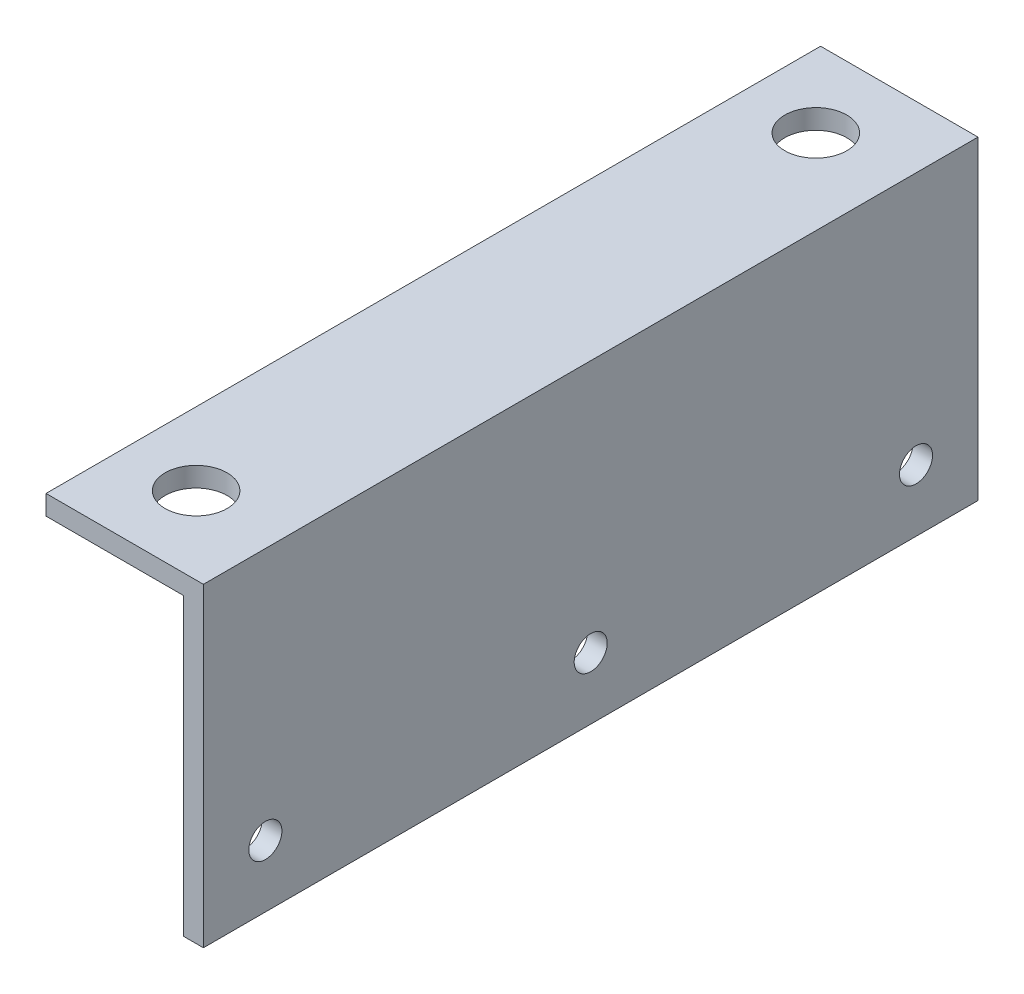
ISO-10303-21;
HEADER;
FILE_DESCRIPTION(('STEP AP214'),'2;1');
FILE_NAME('part.step','',(''),(''),'','','');
FILE_SCHEMA(('AUTOMOTIVE_DESIGN { 1 0 10303 214 1 1 1 1 }'));
ENDSEC;
DATA;
#1=APPLICATION_CONTEXT('core data for automotive mechanical design processes');
#2=APPLICATION_PROTOCOL_DEFINITION('international standard','automotive_design',2000,#1);
#3=PRODUCT_CONTEXT('',#1,'mechanical');
#4=PRODUCT('Part','Part','',(#3));
#5=PRODUCT_RELATED_PRODUCT_CATEGORY('part','',(#4));
#6=PRODUCT_DEFINITION_FORMATION('','',#4);
#7=PRODUCT_DEFINITION_CONTEXT('part definition',#1,'design');
#8=PRODUCT_DEFINITION('design','',#6,#7);
#9=PRODUCT_DEFINITION_SHAPE('','',#8);
#10=(LENGTH_UNIT() NAMED_UNIT(*) SI_UNIT(.MILLI.,.METRE.));
#11=(NAMED_UNIT(*) PLANE_ANGLE_UNIT() SI_UNIT($,.RADIAN.));
#12=(NAMED_UNIT(*) SI_UNIT($,.STERADIAN.) SOLID_ANGLE_UNIT());
#13=UNCERTAINTY_MEASURE_WITH_UNIT(LENGTH_MEASURE(1.E-05),#10,'distance_accuracy_value','');
#14=(GEOMETRIC_REPRESENTATION_CONTEXT(3) GLOBAL_UNCERTAINTY_ASSIGNED_CONTEXT((#13)) GLOBAL_UNIT_ASSIGNED_CONTEXT((#10,
#11,#12)) REPRESENTATION_CONTEXT('',''));
#15=CARTESIAN_POINT('',(0.,0.,0.));
#16=DIRECTION('',(0.,0.,1.));
#17=DIRECTION('',(1.,0.,0.));
#18=AXIS2_PLACEMENT_3D('',#15,#16,#17);
#19=CARTESIAN_POINT('',(0.,50.8,125.));
#20=DIRECTION('',(0.,-1.,0.));
#21=DIRECTION('',(0.,0.,-1.));
#22=AXIS2_PLACEMENT_3D('',#19,#20,#21);
#23=PLANE('',#22);
#24=CARTESIAN_POINT('',(-13.6749999999997,50.8,12.5));
#25=DIRECTION('',(0.,1.,0.));
#26=DIRECTION('',(0.,0.,1.));
#27=AXIS2_PLACEMENT_3D('',#24,#25,#26);
#28=CIRCLE('',#27,5.);
#29=CARTESIAN_POINT('',(-13.6749999999997,50.8,17.5));
#30=VERTEX_POINT('',#29);
#31=EDGE_CURVE('E207',#30,#30,#28,.T.);
#32=ORIENTED_EDGE('',*,*,#31,.F.);
#33=EDGE_LOOP('',(#32));
#34=FACE_BOUND('',#33,.T.);
#35=DIRECTION('',(-1.,0.,0.));
#36=VECTOR('',#35,1.);
#37=CARTESIAN_POINT('',(0.,50.8,0.));
#38=LINE('',#37,#36);
#39=CARTESIAN_POINT('',(0.,50.8,0.));
#40=VERTEX_POINT('',#39);
#41=CARTESIAN_POINT('',(-25.4,50.8,0.));
#42=VERTEX_POINT('',#41);
#43=EDGE_CURVE('E128',#40,#42,#38,.T.);
#44=ORIENTED_EDGE('',*,*,#43,.T.);
#45=DIRECTION('',(0.,0.,-1.));
#46=VECTOR('',#45,1.);
#47=CARTESIAN_POINT('',(-25.4,50.8,125.));
#48=LINE('',#47,#46);
#49=CARTESIAN_POINT('',(-25.4,50.8,125.));
#50=VERTEX_POINT('',#49);
#51=EDGE_CURVE('E112',#50,#42,#48,.T.);
#52=ORIENTED_EDGE('',*,*,#51,.F.);
#53=DIRECTION('',(-1.,0.,0.));
#54=VECTOR('',#53,1.);
#55=CARTESIAN_POINT('',(0.,50.8,125.));
#56=LINE('',#55,#54);
#57=CARTESIAN_POINT('',(0.,50.8,125.));
#58=VERTEX_POINT('',#57);
#59=EDGE_CURVE('E103',#58,#50,#56,.T.);
#60=ORIENTED_EDGE('',*,*,#59,.F.);
#61=DIRECTION('',(0.,0.,-1.));
#62=VECTOR('',#61,1.);
#63=CARTESIAN_POINT('',(0.,50.8,125.));
#64=LINE('',#63,#62);
#65=EDGE_CURVE('E45',#58,#40,#64,.T.);
#66=ORIENTED_EDGE('',*,*,#65,.T.);
#67=EDGE_LOOP('',(#44,#52,#60,#66));
#68=FACE_BOUND('',#67,.T.);
#69=CARTESIAN_POINT('',(-13.6749999999997,50.8,112.5));
#70=DIRECTION('',(0.,1.,0.));
#71=DIRECTION('',(0.,0.,1.));
#72=AXIS2_PLACEMENT_3D('',#69,#70,#71);
#73=CIRCLE('',#72,5.00000000000001);
#74=CARTESIAN_POINT('',(-13.6749999999997,50.8,117.5));
#75=VERTEX_POINT('',#74);
#76=EDGE_CURVE('E187',#75,#75,#73,.F.);
#77=ORIENTED_EDGE('',*,*,#76,.T.);
#78=EDGE_LOOP('',(#77));
#79=FACE_BOUND('',#78,.T.);
#80=ADVANCED_FACE('F36',(#34,#68,#79),#23,.F.);
#81=CARTESIAN_POINT('',(-3.17500000000004,47.625,125.));
#82=DIRECTION('',(0.,1.,0.));
#83=DIRECTION('',(0.,0.,1.));
#84=AXIS2_PLACEMENT_3D('',#81,#82,#83);
#85=PLANE('',#84);
#86=CARTESIAN_POINT('',(-13.6749999999997,47.625,12.5));
#87=DIRECTION('',(0.,1.,0.));
#88=DIRECTION('',(0.,0.,1.));
#89=AXIS2_PLACEMENT_3D('',#86,#87,#88);
#90=CIRCLE('',#89,5.);
#91=CARTESIAN_POINT('',(-13.6749999999997,47.625,17.5));
#92=VERTEX_POINT('',#91);
#93=EDGE_CURVE('E204',#92,#92,#90,.F.);
#94=ORIENTED_EDGE('',*,*,#93,.F.);
#95=EDGE_LOOP('',(#94));
#96=FACE_BOUND('',#95,.T.);
#97=DIRECTION('',(1.,0.,0.));
#98=VECTOR('',#97,1.);
#99=CARTESIAN_POINT('',(-3.17500000000004,47.625,0.));
#100=LINE('',#99,#98);
#101=CARTESIAN_POINT('',(-25.4,47.625,0.));
#102=VERTEX_POINT('',#101);
#103=CARTESIAN_POINT('',(-3.17500000000004,47.625,0.));
#104=VERTEX_POINT('',#103);
#105=EDGE_CURVE('E76',#102,#104,#100,.T.);
#106=ORIENTED_EDGE('',*,*,#105,.T.);
#107=DIRECTION('',(0.,0.,-1.));
#108=VECTOR('',#107,1.);
#109=CARTESIAN_POINT('',(-3.17500000000004,47.625,125.));
#110=LINE('',#109,#108);
#111=CARTESIAN_POINT('',(-3.17500000000004,47.625,125.));
#112=VERTEX_POINT('',#111);
#113=EDGE_CURVE('E113',#112,#104,#110,.T.);
#114=ORIENTED_EDGE('',*,*,#113,.F.);
#115=DIRECTION('',(1.,0.,0.));
#116=VECTOR('',#115,1.);
#117=CARTESIAN_POINT('',(-3.17500000000004,47.625,125.));
#118=LINE('',#117,#116);
#119=CARTESIAN_POINT('',(-25.4,47.625,125.));
#120=VERTEX_POINT('',#119);
#121=EDGE_CURVE('E101',#120,#112,#118,.T.);
#122=ORIENTED_EDGE('',*,*,#121,.F.);
#123=DIRECTION('',(0.,0.,-1.));
#124=VECTOR('',#123,1.);
#125=CARTESIAN_POINT('',(-25.4,47.625,125.));
#126=LINE('',#125,#124);
#127=EDGE_CURVE('E108',#120,#102,#126,.T.);
#128=ORIENTED_EDGE('',*,*,#127,.T.);
#129=EDGE_LOOP('',(#106,#114,#122,#128));
#130=FACE_BOUND('',#129,.T.);
#131=CARTESIAN_POINT('',(-13.6749999999997,47.625,112.5));
#132=DIRECTION('',(0.,1.,0.));
#133=DIRECTION('',(0.,0.,1.));
#134=AXIS2_PLACEMENT_3D('',#131,#132,#133);
#135=CIRCLE('',#134,5.00000000000001);
#136=CARTESIAN_POINT('',(-13.6749999999997,47.625,117.5));
#137=VERTEX_POINT('',#136);
#138=EDGE_CURVE('E192',#137,#137,#135,.T.);
#139=ORIENTED_EDGE('',*,*,#138,.T.);
#140=EDGE_LOOP('',(#139));
#141=FACE_BOUND('',#140,.T.);
#142=ADVANCED_FACE('F115',(#96,#130,#141),#85,.F.);
#143=CARTESIAN_POINT('',(-3.17500000000004,0.,125.));
#144=DIRECTION('',(0.,1.,0.));
#145=DIRECTION('',(0.,0.,1.));
#146=AXIS2_PLACEMENT_3D('',#143,#144,#145);
#147=PLANE('',#146);
#148=DIRECTION('',(1.,0.,0.));
#149=VECTOR('',#148,1.);
#150=CARTESIAN_POINT('',(-3.17500000000004,0.,0.));
#151=LINE('',#150,#149);
#152=CARTESIAN_POINT('',(-3.17500000000004,0.,0.));
#153=VERTEX_POINT('',#152);
#154=CARTESIAN_POINT('',(0.,0.,0.));
#155=VERTEX_POINT('',#154);
#156=EDGE_CURVE('E122',#153,#155,#151,.T.);
#157=ORIENTED_EDGE('',*,*,#156,.T.);
#158=DIRECTION('',(0.,0.,-1.));
#159=VECTOR('',#158,1.);
#160=CARTESIAN_POINT('',(0.,0.,125.));
#161=LINE('',#160,#159);
#162=CARTESIAN_POINT('',(0.,0.,125.));
#163=VERTEX_POINT('',#162);
#164=EDGE_CURVE('E11',#163,#155,#161,.T.);
#165=ORIENTED_EDGE('',*,*,#164,.F.);
#166=DIRECTION('',(1.,0.,0.));
#167=VECTOR('',#166,1.);
#168=CARTESIAN_POINT('',(-3.17500000000004,0.,125.));
#169=LINE('',#168,#167);
#170=CARTESIAN_POINT('',(-3.17500000000004,0.,125.));
#171=VERTEX_POINT('',#170);
#172=EDGE_CURVE('E133',#171,#163,#169,.T.);
#173=ORIENTED_EDGE('',*,*,#172,.F.);
#174=DIRECTION('',(0.,0.,-1.));
#175=VECTOR('',#174,1.);
#176=CARTESIAN_POINT('',(-3.17500000000004,0.,125.));
#177=LINE('',#176,#175);
#178=EDGE_CURVE('E118',#171,#153,#177,.T.);
#179=ORIENTED_EDGE('',*,*,#178,.T.);
#180=EDGE_LOOP('',(#157,#165,#173,#179));
#181=FACE_BOUND('',#180,.T.);
#182=ADVANCED_FACE('F38',(#181),#147,.F.);
#183=CARTESIAN_POINT('',(0.,0.,125.));
#184=DIRECTION('',(-1.,0.,0.));
#185=DIRECTION('',(0.,0.,1.));
#186=AXIS2_PLACEMENT_3D('',#183,#184,#185);
#187=PLANE('',#186);
#188=CARTESIAN_POINT('',(0.,10.,115.));
#189=DIRECTION('',(1.,0.,0.));
#190=DIRECTION('',(0.,0.,-1.));
#191=AXIS2_PLACEMENT_3D('',#188,#189,#190);
#192=CIRCLE('',#191,2.665);
#193=CARTESIAN_POINT('',(0.,10.,112.335));
#194=VERTEX_POINT('',#193);
#195=EDGE_CURVE('E177',#194,#194,#192,.T.);
#196=ORIENTED_EDGE('',*,*,#195,.F.);
#197=EDGE_LOOP('',(#196));
#198=FACE_BOUND('',#197,.T.);
#199=CARTESIAN_POINT('',(0.,9.99999999999999,9.99999999999999));
#200=DIRECTION('',(1.,0.,0.));
#201=DIRECTION('',(0.,0.,-1.));
#202=AXIS2_PLACEMENT_3D('',#199,#200,#201);
#203=CIRCLE('',#202,2.665);
#204=CARTESIAN_POINT('',(0.,9.99999999999999,7.33499999999999));
#205=VERTEX_POINT('',#204);
#206=EDGE_CURVE('E181',#205,#205,#203,.T.);
#207=ORIENTED_EDGE('',*,*,#206,.F.);
#208=EDGE_LOOP('',(#207));
#209=FACE_BOUND('',#208,.T.);
#210=CARTESIAN_POINT('',(0.,9.99999999999999,62.5));
#211=DIRECTION('',(1.,0.,0.));
#212=DIRECTION('',(0.,0.,-1.));
#213=AXIS2_PLACEMENT_3D('',#210,#211,#212);
#214=CIRCLE('',#213,2.665);
#215=CARTESIAN_POINT('',(0.,9.99999999999999,59.835));
#216=VERTEX_POINT('',#215);
#217=EDGE_CURVE('E184',#216,#216,#214,.T.);
#218=ORIENTED_EDGE('',*,*,#217,.F.);
#219=EDGE_LOOP('',(#218));
#220=FACE_BOUND('',#219,.T.);
#221=DIRECTION('',(0.,1.,0.));
#222=VECTOR('',#221,1.);
#223=CARTESIAN_POINT('',(0.,0.,0.));
#224=LINE('',#223,#222);
#225=EDGE_CURVE('E125',#155,#40,#224,.T.);
#226=ORIENTED_EDGE('',*,*,#225,.T.);
#227=ORIENTED_EDGE('',*,*,#65,.F.);
#228=DIRECTION('',(0.,1.,0.));
#229=VECTOR('',#228,1.);
#230=CARTESIAN_POINT('',(0.,0.,125.));
#231=LINE('',#230,#229);
#232=EDGE_CURVE('E90',#163,#58,#231,.T.);
#233=ORIENTED_EDGE('',*,*,#232,.F.);
#234=ORIENTED_EDGE('',*,*,#164,.T.);
#235=EDGE_LOOP('',(#226,#227,#233,#234));
#236=FACE_BOUND('',#235,.T.);
#237=ADVANCED_FACE('F155',(#198,#209,#220,#236),#187,.F.);
#238=CARTESIAN_POINT('',(-25.4,50.8,125.));
#239=DIRECTION('',(1.,0.,0.));
#240=DIRECTION('',(0.,0.,-1.));
#241=AXIS2_PLACEMENT_3D('',#238,#239,#240);
#242=PLANE('',#241);
#243=DIRECTION('',(0.,-1.,0.));
#244=VECTOR('',#243,1.);
#245=CARTESIAN_POINT('',(-25.4,50.8,0.));
#246=LINE('',#245,#244);
#247=EDGE_CURVE('E111',#42,#102,#246,.T.);
#248=ORIENTED_EDGE('',*,*,#247,.T.);
#249=ORIENTED_EDGE('',*,*,#127,.F.);
#250=DIRECTION('',(0.,-1.,0.));
#251=VECTOR('',#250,1.);
#252=CARTESIAN_POINT('',(-25.4,50.8,125.));
#253=LINE('',#252,#251);
#254=EDGE_CURVE('E97',#50,#120,#253,.T.);
#255=ORIENTED_EDGE('',*,*,#254,.F.);
#256=ORIENTED_EDGE('',*,*,#51,.T.);
#257=EDGE_LOOP('',(#248,#249,#255,#256));
#258=FACE_BOUND('',#257,.T.);
#259=ADVANCED_FACE('F109',(#258),#242,.F.);
#260=CARTESIAN_POINT('',(-3.17500000000004,0.,125.));
#261=DIRECTION('',(1.,0.,0.));
#262=DIRECTION('',(0.,0.,-1.));
#263=AXIS2_PLACEMENT_3D('',#260,#261,#262);
#264=PLANE('',#263);
#265=CARTESIAN_POINT('',(-3.17500000000004,10.,115.));
#266=DIRECTION('',(1.,0.,0.));
#267=DIRECTION('',(0.,0.,-1.));
#268=AXIS2_PLACEMENT_3D('',#265,#266,#267);
#269=CIRCLE('',#268,2.665);
#270=CARTESIAN_POINT('',(-3.17500000000004,10.,112.335));
#271=VERTEX_POINT('',#270);
#272=EDGE_CURVE('E126',#271,#271,#269,.F.);
#273=ORIENTED_EDGE('',*,*,#272,.F.);
#274=EDGE_LOOP('',(#273));
#275=FACE_BOUND('',#274,.T.);
#276=CARTESIAN_POINT('',(-3.17500000000004,9.99999999999999,9.99999999999999));
#277=DIRECTION('',(1.,0.,0.));
#278=DIRECTION('',(0.,0.,-1.));
#279=AXIS2_PLACEMENT_3D('',#276,#277,#278);
#280=CIRCLE('',#279,2.665);
#281=CARTESIAN_POINT('',(-3.17500000000004,9.99999999999999,7.33499999999999));
#282=VERTEX_POINT('',#281);
#283=EDGE_CURVE('E195',#282,#282,#280,.F.);
#284=ORIENTED_EDGE('',*,*,#283,.F.);
#285=EDGE_LOOP('',(#284));
#286=FACE_BOUND('',#285,.T.);
#287=CARTESIAN_POINT('',(-3.17500000000004,9.99999999999999,62.5));
#288=DIRECTION('',(1.,0.,0.));
#289=DIRECTION('',(0.,0.,-1.));
#290=AXIS2_PLACEMENT_3D('',#287,#288,#289);
#291=CIRCLE('',#290,2.665);
#292=CARTESIAN_POINT('',(-3.17500000000004,9.99999999999999,59.835));
#293=VERTEX_POINT('',#292);
#294=EDGE_CURVE('E186',#293,#293,#291,.F.);
#295=ORIENTED_EDGE('',*,*,#294,.F.);
#296=EDGE_LOOP('',(#295));
#297=FACE_BOUND('',#296,.T.);
#298=DIRECTION('',(0.,-1.,0.));
#299=VECTOR('',#298,1.);
#300=CARTESIAN_POINT('',(-3.17500000000004,0.,0.));
#301=LINE('',#300,#299);
#302=EDGE_CURVE('E82',#104,#153,#301,.T.);
#303=ORIENTED_EDGE('',*,*,#302,.T.);
#304=ORIENTED_EDGE('',*,*,#178,.F.);
#305=DIRECTION('',(0.,-1.,0.));
#306=VECTOR('',#305,1.);
#307=CARTESIAN_POINT('',(-3.17500000000004,0.,125.));
#308=LINE('',#307,#306);
#309=EDGE_CURVE('E53',#112,#171,#308,.T.);
#310=ORIENTED_EDGE('',*,*,#309,.F.);
#311=ORIENTED_EDGE('',*,*,#113,.T.);
#312=EDGE_LOOP('',(#303,#304,#310,#311));
#313=FACE_BOUND('',#312,.T.);
#314=ADVANCED_FACE('F146',(#275,#286,#297,#313),#264,.F.);
#315=CARTESIAN_POINT('',(0.,0.,125.));
#316=DIRECTION('',(0.,0.,1.));
#317=DIRECTION('',(1.,0.,0.));
#318=AXIS2_PLACEMENT_3D('',#315,#316,#317);
#319=PLANE('',#318);
#320=ORIENTED_EDGE('',*,*,#172,.T.);
#321=ORIENTED_EDGE('',*,*,#232,.T.);
#322=ORIENTED_EDGE('',*,*,#59,.T.);
#323=ORIENTED_EDGE('',*,*,#254,.T.);
#324=ORIENTED_EDGE('',*,*,#121,.T.);
#325=ORIENTED_EDGE('',*,*,#309,.T.);
#326=EDGE_LOOP('',(#320,#321,#322,#323,#324,#325));
#327=FACE_BOUND('',#326,.T.);
#328=ADVANCED_FACE('F99',(#327),#319,.T.);
#329=CARTESIAN_POINT('',(0.,0.,0.));
#330=DIRECTION('',(0.,0.,1.));
#331=DIRECTION('',(1.,0.,0.));
#332=AXIS2_PLACEMENT_3D('',#329,#330,#331);
#333=PLANE('',#332);
#334=ORIENTED_EDGE('',*,*,#156,.F.);
#335=ORIENTED_EDGE('',*,*,#302,.F.);
#336=ORIENTED_EDGE('',*,*,#105,.F.);
#337=ORIENTED_EDGE('',*,*,#247,.F.);
#338=ORIENTED_EDGE('',*,*,#43,.F.);
#339=ORIENTED_EDGE('',*,*,#225,.F.);
#340=EDGE_LOOP('',(#334,#335,#336,#337,#338,#339));
#341=FACE_BOUND('',#340,.T.);
#342=ADVANCED_FACE('F142',(#341),#333,.F.);
#343=CARTESIAN_POINT('',(-25.401,9.99999999999998,62.5));
#344=DIRECTION('',(1.,0.,0.));
#345=DIRECTION('',(0.,0.,-1.));
#346=AXIS2_PLACEMENT_3D('',#343,#344,#345);
#347=CYLINDRICAL_SURFACE('',#346,2.665);
#348=CARTESIAN_POINT('',(0.,9.99999999999999,59.835));
#349=CARTESIAN_POINT('',(-0.0330729166666636,9.99999999999999,59.835));
#350=CARTESIAN_POINT('',(-0.0661458333333307,9.99999999999999,59.835));
#351=CARTESIAN_POINT('',(-0.132291666666665,9.99999999999999,59.835));
#352=CARTESIAN_POINT('',(-0.165364583333332,9.99999999999999,59.835));
#353=CARTESIAN_POINT('',(-0.231510416666666,9.99999999999999,59.835));
#354=CARTESIAN_POINT('',(-0.264583333333333,9.99999999999999,59.835));
#355=CARTESIAN_POINT('',(-0.330729166666667,9.99999999999999,59.835));
#356=CARTESIAN_POINT('',(-0.363802083333334,9.99999999999999,59.835));
#357=CARTESIAN_POINT('',(-0.429947916666668,9.99999999999999,59.835));
#358=CARTESIAN_POINT('',(-0.463020833333336,9.99999999999999,59.835));
#359=CARTESIAN_POINT('',(-0.52916666666667,9.99999999999999,59.835));
#360=CARTESIAN_POINT('',(-0.562239583333337,9.99999999999999,59.835));
#361=CARTESIAN_POINT('',(-0.628385416666671,9.99999999999999,59.835));
#362=CARTESIAN_POINT('',(-0.661458333333338,9.99999999999999,59.835));
#363=CARTESIAN_POINT('',(-0.727604166666672,9.99999999999999,59.835));
#364=CARTESIAN_POINT('',(-0.760677083333339,9.99999999999999,59.835));
#365=CARTESIAN_POINT('',(-0.826822916666673,9.99999999999999,59.835));
#366=CARTESIAN_POINT('',(-0.85989583333334,9.99999999999999,59.835));
#367=CARTESIAN_POINT('',(-0.926041666666675,9.99999999999999,59.835));
#368=CARTESIAN_POINT('',(-0.959114583333342,9.99999999999999,59.835));
#369=CARTESIAN_POINT('',(-1.02526041666668,9.99999999999999,59.835));
#370=CARTESIAN_POINT('',(-1.05833333333334,9.99999999999999,59.835));
#371=CARTESIAN_POINT('',(-1.12447916666668,9.99999999999999,59.835));
#372=CARTESIAN_POINT('',(-1.15755208333334,9.99999999999999,59.835));
#373=CARTESIAN_POINT('',(-1.22369791666668,9.99999999999999,59.835));
#374=CARTESIAN_POINT('',(-1.25677083333335,9.99999999999999,59.835));
#375=CARTESIAN_POINT('',(-1.32291666666668,9.99999999999999,59.835));
#376=CARTESIAN_POINT('',(-1.35598958333335,9.99999999999999,59.835));
#377=CARTESIAN_POINT('',(-1.42213541666668,9.99999999999999,59.835));
#378=CARTESIAN_POINT('',(-1.45520833333335,9.99999999999999,59.835));
#379=CARTESIAN_POINT('',(-1.52135416666668,9.99999999999999,59.835));
#380=CARTESIAN_POINT('',(-1.55442708333335,9.99999999999999,59.835));
#381=CARTESIAN_POINT('',(-1.62057291666668,9.99999999999999,59.835));
#382=CARTESIAN_POINT('',(-1.65364583333335,9.99999999999999,59.835));
#383=CARTESIAN_POINT('',(-1.71979166666668,9.99999999999999,59.835));
#384=CARTESIAN_POINT('',(-1.75286458333335,9.99999999999999,59.835));
#385=CARTESIAN_POINT('',(-1.81901041666669,9.99999999999999,59.835));
#386=CARTESIAN_POINT('',(-1.85208333333335,9.99999999999999,59.835));
#387=CARTESIAN_POINT('',(-1.91822916666669,9.99999999999999,59.835));
#388=CARTESIAN_POINT('',(-1.95130208333335,9.99999999999999,59.835));
#389=CARTESIAN_POINT('',(-2.01744791666669,9.99999999999999,59.835));
#390=CARTESIAN_POINT('',(-2.05052083333336,9.99999999999999,59.835));
#391=CARTESIAN_POINT('',(-2.11666666666669,9.99999999999999,59.835));
#392=CARTESIAN_POINT('',(-2.14973958333336,9.99999999999999,59.835));
#393=CARTESIAN_POINT('',(-2.21588541666669,9.99999999999999,59.835));
#394=CARTESIAN_POINT('',(-2.24895833333336,9.99999999999999,59.835));
#395=CARTESIAN_POINT('',(-2.31510416666669,9.99999999999999,59.835));
#396=CARTESIAN_POINT('',(-2.34817708333336,9.99999999999999,59.835));
#397=CARTESIAN_POINT('',(-2.41432291666669,9.99999999999999,59.835));
#398=CARTESIAN_POINT('',(-2.44739583333336,9.99999999999999,59.835));
#399=CARTESIAN_POINT('',(-2.51354166666669,9.99999999999999,59.835));
#400=CARTESIAN_POINT('',(-2.54661458333336,9.99999999999999,59.835));
#401=CARTESIAN_POINT('',(-2.6127604166667,9.99999999999999,59.835));
#402=CARTESIAN_POINT('',(-2.64583333333336,9.99999999999999,59.835));
#403=CARTESIAN_POINT('',(-2.7119791666667,9.99999999999999,59.835));
#404=CARTESIAN_POINT('',(-2.74505208333336,9.99999999999999,59.835));
#405=CARTESIAN_POINT('',(-2.8111979166667,9.99999999999999,59.835));
#406=CARTESIAN_POINT('',(-2.84427083333336,9.99999999999999,59.835));
#407=CARTESIAN_POINT('',(-2.9104166666667,9.99999999999999,59.835));
#408=CARTESIAN_POINT('',(-2.94348958333337,9.99999999999999,59.835));
#409=CARTESIAN_POINT('',(-3.0096354166667,9.99999999999999,59.835));
#410=CARTESIAN_POINT('',(-3.04270833333337,9.99999999999999,59.835));
#411=CARTESIAN_POINT('',(-3.1088541666667,9.99999999999999,59.835));
#412=CARTESIAN_POINT('',(-3.14192708333337,9.99999999999999,59.835));
#413=CARTESIAN_POINT('',(-3.17500000000004,9.99999999999999,59.835));
#414=B_SPLINE_CURVE_WITH_KNOTS('',3,(#348,#349,#350,#351,#352,#353,#354,#355,#356,#357,#358,
#359,#360,#361,#362,#363,#364,#365,#366,#367,#368,#369,#370,#371,#372,#373,#374,#375,#376,#377,
#378,#379,#380,#381,#382,#383,#384,#385,#386,#387,#388,#389,#390,#391,#392,#393,#394,#395,#396,
#397,#398,#399,#400,#401,#402,#403,#404,#405,#406,#407,#408,#409,#410,#411,#412,#413),
.UNSPECIFIED.,.F.,.F.,(4,2,2,2,2,2,2,2,2,2,2,2,2,2,2,2,2,2,2,2,2,2,2,2,2,2,2,2,2,2,2,2,4),(0.,
0.0992187500000012,0.198437500000002,0.297656250000004,0.396875000000005,0.496093750000006,
0.595312500000007,0.694531250000008,0.79375000000001,0.892968750000011,0.992187500000012,
1.09140625000001,1.19062500000001,1.28984375000002,1.38906250000002,1.48828125000002,
1.58750000000002,1.68671875000002,1.78593750000002,1.88515625000002,1.98437500000002,
2.08359375000003,2.18281250000003,2.28203125000003,2.38125000000003,2.48046875000003,
2.57968750000003,2.67890625000003,2.77812500000003,2.87734375000004,2.97656250000004,
3.07578125000004,3.17500000000004),.UNSPECIFIED.);
#415=EDGE_CURVE('BSEAM232',#216,#293,#414,.T.);
#416=ORIENTED_EDGE('',*,*,#217,.T.);
#417=ORIENTED_EDGE('',*,*,#294,.T.);
#418=ORIENTED_EDGE('',*,*,#415,.T.);
#419=ORIENTED_EDGE('',*,*,#415,.F.);
#420=EDGE_LOOP('',(#416,#418,#417,#419));
#421=FACE_BOUND('',#420,.T.);
#422=ADVANCED_FACE('F232',(#421),#347,.F.);
#423=CARTESIAN_POINT('',(-25.401,9.99999999999998,9.99999999999999));
#424=DIRECTION('',(1.,0.,0.));
#425=DIRECTION('',(0.,0.,-1.));
#426=AXIS2_PLACEMENT_3D('',#423,#424,#425);
#427=CYLINDRICAL_SURFACE('',#426,2.665);
#428=CARTESIAN_POINT('',(0.,9.99999999999999,7.33499999999999));
#429=CARTESIAN_POINT('',(-0.0330729166666636,9.99999999999999,7.33499999999999));
#430=CARTESIAN_POINT('',(-0.0661458333333307,9.99999999999999,7.33499999999999));
#431=CARTESIAN_POINT('',(-0.132291666666665,9.99999999999999,7.33499999999999));
#432=CARTESIAN_POINT('',(-0.165364583333332,9.99999999999999,7.33499999999999));
#433=CARTESIAN_POINT('',(-0.231510416666666,9.99999999999999,7.33499999999999));
#434=CARTESIAN_POINT('',(-0.264583333333333,9.99999999999999,7.33499999999999));
#435=CARTESIAN_POINT('',(-0.330729166666667,9.99999999999999,7.33499999999999));
#436=CARTESIAN_POINT('',(-0.363802083333334,9.99999999999999,7.33499999999999));
#437=CARTESIAN_POINT('',(-0.429947916666668,9.99999999999999,7.33499999999999));
#438=CARTESIAN_POINT('',(-0.463020833333336,9.99999999999999,7.33499999999999));
#439=CARTESIAN_POINT('',(-0.52916666666667,9.99999999999999,7.33499999999999));
#440=CARTESIAN_POINT('',(-0.562239583333337,9.99999999999999,7.33499999999999));
#441=CARTESIAN_POINT('',(-0.628385416666671,9.99999999999999,7.33499999999999));
#442=CARTESIAN_POINT('',(-0.661458333333338,9.99999999999999,7.33499999999999));
#443=CARTESIAN_POINT('',(-0.727604166666672,9.99999999999999,7.33499999999999));
#444=CARTESIAN_POINT('',(-0.760677083333339,9.99999999999999,7.33499999999999));
#445=CARTESIAN_POINT('',(-0.826822916666673,9.99999999999999,7.33499999999999));
#446=CARTESIAN_POINT('',(-0.85989583333334,9.99999999999999,7.33499999999999));
#447=CARTESIAN_POINT('',(-0.926041666666675,9.99999999999999,7.33499999999999));
#448=CARTESIAN_POINT('',(-0.959114583333342,9.99999999999999,7.33499999999999));
#449=CARTESIAN_POINT('',(-1.02526041666668,9.99999999999999,7.33499999999999));
#450=CARTESIAN_POINT('',(-1.05833333333334,9.99999999999999,7.33499999999999));
#451=CARTESIAN_POINT('',(-1.12447916666668,9.99999999999999,7.33499999999999));
#452=CARTESIAN_POINT('',(-1.15755208333334,9.99999999999999,7.33499999999999));
#453=CARTESIAN_POINT('',(-1.22369791666668,9.99999999999999,7.33499999999999));
#454=CARTESIAN_POINT('',(-1.25677083333335,9.99999999999999,7.33499999999999));
#455=CARTESIAN_POINT('',(-1.32291666666668,9.99999999999999,7.33499999999999));
#456=CARTESIAN_POINT('',(-1.35598958333335,9.99999999999999,7.33499999999999));
#457=CARTESIAN_POINT('',(-1.42213541666668,9.99999999999999,7.33499999999999));
#458=CARTESIAN_POINT('',(-1.45520833333335,9.99999999999999,7.33499999999999));
#459=CARTESIAN_POINT('',(-1.52135416666668,9.99999999999999,7.33499999999999));
#460=CARTESIAN_POINT('',(-1.55442708333335,9.99999999999999,7.33499999999999));
#461=CARTESIAN_POINT('',(-1.62057291666668,9.99999999999999,7.33499999999999));
#462=CARTESIAN_POINT('',(-1.65364583333335,9.99999999999999,7.33499999999999));
#463=CARTESIAN_POINT('',(-1.71979166666668,9.99999999999999,7.33499999999999));
#464=CARTESIAN_POINT('',(-1.75286458333335,9.99999999999999,7.33499999999999));
#465=CARTESIAN_POINT('',(-1.81901041666669,9.99999999999999,7.33499999999999));
#466=CARTESIAN_POINT('',(-1.85208333333335,9.99999999999999,7.33499999999999));
#467=CARTESIAN_POINT('',(-1.91822916666669,9.99999999999999,7.33499999999999));
#468=CARTESIAN_POINT('',(-1.95130208333335,9.99999999999999,7.33499999999999));
#469=CARTESIAN_POINT('',(-2.01744791666669,9.99999999999999,7.33499999999999));
#470=CARTESIAN_POINT('',(-2.05052083333336,9.99999999999999,7.33499999999999));
#471=CARTESIAN_POINT('',(-2.11666666666669,9.99999999999999,7.33499999999999));
#472=CARTESIAN_POINT('',(-2.14973958333336,9.99999999999999,7.33499999999999));
#473=CARTESIAN_POINT('',(-2.21588541666669,9.99999999999999,7.33499999999999));
#474=CARTESIAN_POINT('',(-2.24895833333336,9.99999999999999,7.33499999999999));
#475=CARTESIAN_POINT('',(-2.31510416666669,9.99999999999999,7.33499999999999));
#476=CARTESIAN_POINT('',(-2.34817708333336,9.99999999999999,7.33499999999999));
#477=CARTESIAN_POINT('',(-2.41432291666669,9.99999999999999,7.33499999999999));
#478=CARTESIAN_POINT('',(-2.44739583333336,9.99999999999999,7.33499999999999));
#479=CARTESIAN_POINT('',(-2.51354166666669,9.99999999999999,7.33499999999999));
#480=CARTESIAN_POINT('',(-2.54661458333336,9.99999999999999,7.33499999999999));
#481=CARTESIAN_POINT('',(-2.6127604166667,9.99999999999999,7.33499999999999));
#482=CARTESIAN_POINT('',(-2.64583333333336,9.99999999999999,7.33499999999999));
#483=CARTESIAN_POINT('',(-2.7119791666667,9.99999999999999,7.33499999999999));
#484=CARTESIAN_POINT('',(-2.74505208333336,9.99999999999999,7.33499999999999));
#485=CARTESIAN_POINT('',(-2.8111979166667,9.99999999999999,7.33499999999999));
#486=CARTESIAN_POINT('',(-2.84427083333336,9.99999999999999,7.33499999999999));
#487=CARTESIAN_POINT('',(-2.9104166666667,9.99999999999999,7.33499999999999));
#488=CARTESIAN_POINT('',(-2.94348958333337,9.99999999999999,7.33499999999999));
#489=CARTESIAN_POINT('',(-3.0096354166667,9.99999999999999,7.33499999999999));
#490=CARTESIAN_POINT('',(-3.04270833333337,9.99999999999999,7.33499999999999));
#491=CARTESIAN_POINT('',(-3.1088541666667,9.99999999999999,7.33499999999999));
#492=CARTESIAN_POINT('',(-3.14192708333337,9.99999999999999,7.33499999999999));
#493=CARTESIAN_POINT('',(-3.17500000000004,9.99999999999999,7.33499999999999));
#494=B_SPLINE_CURVE_WITH_KNOTS('',3,(#428,#429,#430,#431,#432,#433,#434,#435,#436,#437,#438,
#439,#440,#441,#442,#443,#444,#445,#446,#447,#448,#449,#450,#451,#452,#453,#454,#455,#456,#457,
#458,#459,#460,#461,#462,#463,#464,#465,#466,#467,#468,#469,#470,#471,#472,#473,#474,#475,#476,
#477,#478,#479,#480,#481,#482,#483,#484,#485,#486,#487,#488,#489,#490,#491,#492,#493),
.UNSPECIFIED.,.F.,.F.,(4,2,2,2,2,2,2,2,2,2,2,2,2,2,2,2,2,2,2,2,2,2,2,2,2,2,2,2,2,2,2,2,4),(0.,
0.0992187500000012,0.198437500000002,0.297656250000004,0.396875000000005,0.496093750000006,
0.595312500000007,0.694531250000008,0.79375000000001,0.892968750000011,0.992187500000012,
1.09140625000001,1.19062500000001,1.28984375000002,1.38906250000002,1.48828125000002,
1.58750000000002,1.68671875000002,1.78593750000002,1.88515625000002,1.98437500000002,
2.08359375000003,2.18281250000003,2.28203125000003,2.38125000000003,2.48046875000003,
2.57968750000003,2.67890625000003,2.77812500000003,2.87734375000004,2.97656250000004,
3.07578125000004,3.17500000000004),.UNSPECIFIED.);
#495=EDGE_CURVE('BSEAM228',#205,#282,#494,.T.);
#496=ORIENTED_EDGE('',*,*,#206,.T.);
#497=ORIENTED_EDGE('',*,*,#283,.T.);
#498=ORIENTED_EDGE('',*,*,#495,.T.);
#499=ORIENTED_EDGE('',*,*,#495,.F.);
#500=EDGE_LOOP('',(#496,#498,#497,#499));
#501=FACE_BOUND('',#500,.T.);
#502=ADVANCED_FACE('F228',(#501),#427,.F.);
#503=CARTESIAN_POINT('',(-25.401,9.99999999999999,115.));
#504=DIRECTION('',(1.,0.,0.));
#505=DIRECTION('',(0.,0.,-1.));
#506=AXIS2_PLACEMENT_3D('',#503,#504,#505);
#507=CYLINDRICAL_SURFACE('',#506,2.665);
#508=CARTESIAN_POINT('',(0.,10.,112.335));
#509=CARTESIAN_POINT('',(-0.0330729166666636,10.,112.335));
#510=CARTESIAN_POINT('',(-0.0661458333333307,10.,112.335));
#511=CARTESIAN_POINT('',(-0.132291666666665,10.,112.335));
#512=CARTESIAN_POINT('',(-0.165364583333332,10.,112.335));
#513=CARTESIAN_POINT('',(-0.231510416666666,10.,112.335));
#514=CARTESIAN_POINT('',(-0.264583333333333,10.,112.335));
#515=CARTESIAN_POINT('',(-0.330729166666667,10.,112.335));
#516=CARTESIAN_POINT('',(-0.363802083333334,10.,112.335));
#517=CARTESIAN_POINT('',(-0.429947916666668,10.,112.335));
#518=CARTESIAN_POINT('',(-0.463020833333336,10.,112.335));
#519=CARTESIAN_POINT('',(-0.52916666666667,10.,112.335));
#520=CARTESIAN_POINT('',(-0.562239583333337,10.,112.335));
#521=CARTESIAN_POINT('',(-0.628385416666671,10.,112.335));
#522=CARTESIAN_POINT('',(-0.661458333333338,10.,112.335));
#523=CARTESIAN_POINT('',(-0.727604166666672,10.,112.335));
#524=CARTESIAN_POINT('',(-0.760677083333339,10.,112.335));
#525=CARTESIAN_POINT('',(-0.826822916666673,10.,112.335));
#526=CARTESIAN_POINT('',(-0.85989583333334,10.,112.335));
#527=CARTESIAN_POINT('',(-0.926041666666675,10.,112.335));
#528=CARTESIAN_POINT('',(-0.959114583333342,10.,112.335));
#529=CARTESIAN_POINT('',(-1.02526041666668,10.,112.335));
#530=CARTESIAN_POINT('',(-1.05833333333334,10.,112.335));
#531=CARTESIAN_POINT('',(-1.12447916666668,10.,112.335));
#532=CARTESIAN_POINT('',(-1.15755208333334,10.,112.335));
#533=CARTESIAN_POINT('',(-1.22369791666668,10.,112.335));
#534=CARTESIAN_POINT('',(-1.25677083333335,10.,112.335));
#535=CARTESIAN_POINT('',(-1.32291666666668,10.,112.335));
#536=CARTESIAN_POINT('',(-1.35598958333335,10.,112.335));
#537=CARTESIAN_POINT('',(-1.42213541666668,10.,112.335));
#538=CARTESIAN_POINT('',(-1.45520833333335,10.,112.335));
#539=CARTESIAN_POINT('',(-1.52135416666668,10.,112.335));
#540=CARTESIAN_POINT('',(-1.55442708333335,10.,112.335));
#541=CARTESIAN_POINT('',(-1.62057291666668,10.,112.335));
#542=CARTESIAN_POINT('',(-1.65364583333335,10.,112.335));
#543=CARTESIAN_POINT('',(-1.71979166666668,10.,112.335));
#544=CARTESIAN_POINT('',(-1.75286458333335,10.,112.335));
#545=CARTESIAN_POINT('',(-1.81901041666669,10.,112.335));
#546=CARTESIAN_POINT('',(-1.85208333333335,10.,112.335));
#547=CARTESIAN_POINT('',(-1.91822916666669,10.,112.335));
#548=CARTESIAN_POINT('',(-1.95130208333335,10.,112.335));
#549=CARTESIAN_POINT('',(-2.01744791666669,10.,112.335));
#550=CARTESIAN_POINT('',(-2.05052083333336,10.,112.335));
#551=CARTESIAN_POINT('',(-2.11666666666669,10.,112.335));
#552=CARTESIAN_POINT('',(-2.14973958333336,10.,112.335));
#553=CARTESIAN_POINT('',(-2.21588541666669,10.,112.335));
#554=CARTESIAN_POINT('',(-2.24895833333336,10.,112.335));
#555=CARTESIAN_POINT('',(-2.31510416666669,10.,112.335));
#556=CARTESIAN_POINT('',(-2.34817708333336,10.,112.335));
#557=CARTESIAN_POINT('',(-2.41432291666669,10.,112.335));
#558=CARTESIAN_POINT('',(-2.44739583333336,10.,112.335));
#559=CARTESIAN_POINT('',(-2.51354166666669,10.,112.335));
#560=CARTESIAN_POINT('',(-2.54661458333336,10.,112.335));
#561=CARTESIAN_POINT('',(-2.6127604166667,10.,112.335));
#562=CARTESIAN_POINT('',(-2.64583333333336,10.,112.335));
#563=CARTESIAN_POINT('',(-2.7119791666667,10.,112.335));
#564=CARTESIAN_POINT('',(-2.74505208333336,10.,112.335));
#565=CARTESIAN_POINT('',(-2.8111979166667,10.,112.335));
#566=CARTESIAN_POINT('',(-2.84427083333336,10.,112.335));
#567=CARTESIAN_POINT('',(-2.9104166666667,10.,112.335));
#568=CARTESIAN_POINT('',(-2.94348958333337,10.,112.335));
#569=CARTESIAN_POINT('',(-3.0096354166667,10.,112.335));
#570=CARTESIAN_POINT('',(-3.04270833333337,10.,112.335));
#571=CARTESIAN_POINT('',(-3.1088541666667,10.,112.335));
#572=CARTESIAN_POINT('',(-3.14192708333337,10.,112.335));
#573=CARTESIAN_POINT('',(-3.17500000000004,10.,112.335));
#574=B_SPLINE_CURVE_WITH_KNOTS('',3,(#508,#509,#510,#511,#512,#513,#514,#515,#516,#517,#518,
#519,#520,#521,#522,#523,#524,#525,#526,#527,#528,#529,#530,#531,#532,#533,#534,#535,#536,#537,
#538,#539,#540,#541,#542,#543,#544,#545,#546,#547,#548,#549,#550,#551,#552,#553,#554,#555,#556,
#557,#558,#559,#560,#561,#562,#563,#564,#565,#566,#567,#568,#569,#570,#571,#572,#573),
.UNSPECIFIED.,.F.,.F.,(4,2,2,2,2,2,2,2,2,2,2,2,2,2,2,2,2,2,2,2,2,2,2,2,2,2,2,2,2,2,2,2,4),(0.,
0.0992187500000012,0.198437500000002,0.297656250000004,0.396875000000005,0.496093750000006,
0.595312500000007,0.694531250000008,0.79375000000001,0.892968750000011,0.992187500000012,
1.09140625000001,1.19062500000001,1.28984375000002,1.38906250000002,1.48828125000002,
1.58750000000002,1.68671875000002,1.78593750000002,1.88515625000002,1.98437500000002,
2.08359375000003,2.18281250000003,2.28203125000003,2.38125000000003,2.48046875000003,
2.57968750000003,2.67890625000003,2.77812500000003,2.87734375000004,2.97656250000004,
3.07578125000004,3.17500000000004),.UNSPECIFIED.);
#575=EDGE_CURVE('BSEAM221',#194,#271,#574,.T.);
#576=ORIENTED_EDGE('',*,*,#195,.T.);
#577=ORIENTED_EDGE('',*,*,#272,.T.);
#578=ORIENTED_EDGE('',*,*,#575,.T.);
#579=ORIENTED_EDGE('',*,*,#575,.F.);
#580=EDGE_LOOP('',(#576,#578,#577,#579));
#581=FACE_BOUND('',#580,.T.);
#582=ADVANCED_FACE('F221',(#581),#507,.F.);
#583=CARTESIAN_POINT('',(-13.6749999999997,-0.001000000000001,12.5));
#584=DIRECTION('',(0.,1.,0.));
#585=DIRECTION('',(0.,0.,1.));
#586=AXIS2_PLACEMENT_3D('',#583,#584,#585);
#587=CYLINDRICAL_SURFACE('',#586,5.);
#588=ORIENTED_EDGE('',*,*,#31,.T.);
#589=EDGE_LOOP('',(#588));
#590=FACE_BOUND('',#589,.T.);
#591=ORIENTED_EDGE('',*,*,#93,.T.);
#592=EDGE_LOOP('',(#591));
#593=FACE_BOUND('',#592,.T.);
#594=ADVANCED_FACE('F215',(#590,#593),#587,.F.);
#595=CARTESIAN_POINT('',(-13.6749999999997,-0.000999999999987122,112.5));
#596=DIRECTION('',(0.,1.,0.));
#597=DIRECTION('',(0.,0.,1.));
#598=AXIS2_PLACEMENT_3D('',#595,#596,#597);
#599=CYLINDRICAL_SURFACE('',#598,5.00000000000001);
#600=ORIENTED_EDGE('',*,*,#76,.F.);
#601=EDGE_LOOP('',(#600));
#602=FACE_BOUND('',#601,.T.);
#603=ORIENTED_EDGE('',*,*,#138,.F.);
#604=EDGE_LOOP('',(#603));
#605=FACE_BOUND('',#604,.T.);
#606=ADVANCED_FACE('F213',(#602,#605),#599,.F.);
#607=CLOSED_SHELL('',(#80,#142,#182,#237,#259,#314,#328,#342,#422,#502,#582,#594,#606));
#608=MANIFOLD_SOLID_BREP('B2',#607);
#609=ADVANCED_BREP_SHAPE_REPRESENTATION('',(#18,#608),#14);
#610=SHAPE_DEFINITION_REPRESENTATION(#9,#609);
ENDSEC;
END-ISO-10303-21;
